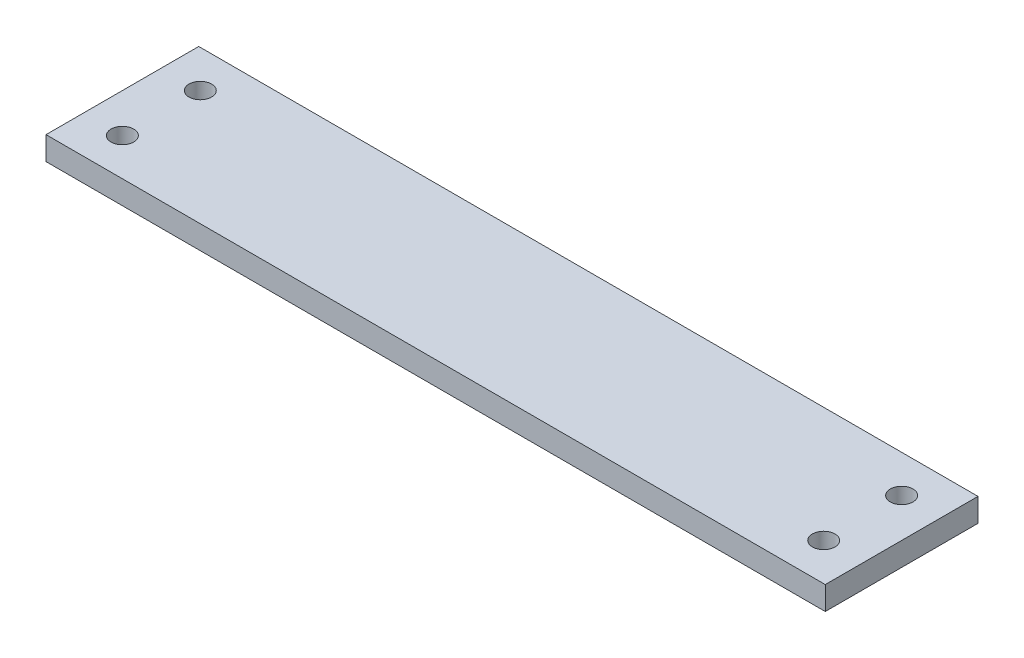
ISO-10303-21;
HEADER;
FILE_DESCRIPTION(('STEP AP214'),'2;1');
FILE_NAME('part.step','',(''),(''),'','','');
FILE_SCHEMA(('AUTOMOTIVE_DESIGN { 1 0 10303 214 1 1 1 1 }'));
ENDSEC;
DATA;
#1=APPLICATION_CONTEXT('core data for automotive mechanical design processes');
#2=APPLICATION_PROTOCOL_DEFINITION('international standard','automotive_design',2000,#1);
#3=PRODUCT_CONTEXT('',#1,'mechanical');
#4=PRODUCT('Part','Part','',(#3));
#5=PRODUCT_RELATED_PRODUCT_CATEGORY('part','',(#4));
#6=PRODUCT_DEFINITION_FORMATION('','',#4);
#7=PRODUCT_DEFINITION_CONTEXT('part definition',#1,'design');
#8=PRODUCT_DEFINITION('design','',#6,#7);
#9=PRODUCT_DEFINITION_SHAPE('','',#8);
#10=(LENGTH_UNIT() NAMED_UNIT(*) SI_UNIT(.MILLI.,.METRE.));
#11=(NAMED_UNIT(*) PLANE_ANGLE_UNIT() SI_UNIT($,.RADIAN.));
#12=(NAMED_UNIT(*) SI_UNIT($,.STERADIAN.) SOLID_ANGLE_UNIT());
#13=UNCERTAINTY_MEASURE_WITH_UNIT(LENGTH_MEASURE(1.E-05),#10,'distance_accuracy_value','');
#14=(GEOMETRIC_REPRESENTATION_CONTEXT(3) GLOBAL_UNCERTAINTY_ASSIGNED_CONTEXT((#13)) GLOBAL_UNIT_ASSIGNED_CONTEXT((#10,
#11,#12)) REPRESENTATION_CONTEXT('',''));
#15=CARTESIAN_POINT('',(0.,0.,0.));
#16=DIRECTION('',(0.,0.,1.));
#17=DIRECTION('',(1.,0.,0.));
#18=AXIS2_PLACEMENT_3D('',#15,#16,#17);
#19=CARTESIAN_POINT('',(0.,3.,0.));
#20=DIRECTION('',(-1.,0.,0.));
#21=DIRECTION('',(0.,0.,1.));
#22=AXIS2_PLACEMENT_3D('',#19,#20,#21);
#23=PLANE('',#22);
#24=DIRECTION('',(0.,-1.,0.));
#25=VECTOR('',#24,1.);
#26=CARTESIAN_POINT('',(0.,3.,-19.8));
#27=LINE('',#26,#25);
#28=CARTESIAN_POINT('',(0.,3.,-19.8));
#29=VERTEX_POINT('',#28);
#30=CARTESIAN_POINT('',(0.,0.,-19.8));
#31=VERTEX_POINT('',#30);
#32=EDGE_CURVE('E52',#29,#31,#27,.T.);
#33=ORIENTED_EDGE('',*,*,#32,.F.);
#34=DIRECTION('',(0.,0.,-1.));
#35=VECTOR('',#34,1.);
#36=CARTESIAN_POINT('',(0.,3.,0.));
#37=LINE('',#36,#35);
#38=CARTESIAN_POINT('',(0.,3.,-0.2));
#39=VERTEX_POINT('',#38);
#40=EDGE_CURVE('E44',#39,#29,#37,.T.);
#41=ORIENTED_EDGE('',*,*,#40,.F.);
#42=DIRECTION('',(0.,1.,0.));
#43=VECTOR('',#42,1.);
#44=CARTESIAN_POINT('',(0.,0.,-0.2));
#45=LINE('',#44,#43);
#46=CARTESIAN_POINT('',(0.,0.,-0.2));
#47=VERTEX_POINT('',#46);
#48=EDGE_CURVE('E144',#47,#39,#45,.T.);
#49=ORIENTED_EDGE('',*,*,#48,.F.);
#50=DIRECTION('',(0.,0.,-1.));
#51=VECTOR('',#50,1.);
#52=CARTESIAN_POINT('',(0.,0.,0.));
#53=LINE('',#52,#51);
#54=EDGE_CURVE('E91',#47,#31,#53,.T.);
#55=ORIENTED_EDGE('',*,*,#54,.T.);
#56=EDGE_LOOP('',(#33,#41,#49,#55));
#57=FACE_BOUND('',#56,.T.);
#58=ADVANCED_FACE('F36',(#57),#23,.F.);
#59=CARTESIAN_POINT('',(-100.,3.,0.));
#60=DIRECTION('',(1.,0.,0.));
#61=DIRECTION('',(0.,0.,-1.));
#62=AXIS2_PLACEMENT_3D('',#59,#60,#61);
#63=PLANE('',#62);
#64=DIRECTION('',(0.,1.,0.));
#65=VECTOR('',#64,1.);
#66=CARTESIAN_POINT('',(-100.,0.,-19.8));
#67=LINE('',#66,#65);
#68=CARTESIAN_POINT('',(-100.,0.,-19.8));
#69=VERTEX_POINT('',#68);
#70=CARTESIAN_POINT('',(-100.,3.,-19.8));
#71=VERTEX_POINT('',#70);
#72=EDGE_CURVE('E78',#69,#71,#67,.T.);
#73=ORIENTED_EDGE('',*,*,#72,.F.);
#74=DIRECTION('',(0.,0.,1.));
#75=VECTOR('',#74,1.);
#76=CARTESIAN_POINT('',(-100.,0.,0.));
#77=LINE('',#76,#75);
#78=CARTESIAN_POINT('',(-100.,0.,-0.2));
#79=VERTEX_POINT('',#78);
#80=EDGE_CURVE('E60',#69,#79,#77,.T.);
#81=ORIENTED_EDGE('',*,*,#80,.T.);
#82=DIRECTION('',(0.,-1.,0.));
#83=VECTOR('',#82,1.);
#84=CARTESIAN_POINT('',(-100.,3.,-0.2));
#85=LINE('',#84,#83);
#86=CARTESIAN_POINT('',(-100.,3.,-0.2));
#87=VERTEX_POINT('',#86);
#88=EDGE_CURVE('E239',#87,#79,#85,.T.);
#89=ORIENTED_EDGE('',*,*,#88,.F.);
#90=DIRECTION('',(0.,0.,1.));
#91=VECTOR('',#90,1.);
#92=CARTESIAN_POINT('',(-100.,3.,0.));
#93=LINE('',#92,#91);
#94=EDGE_CURVE('E11',#71,#87,#93,.T.);
#95=ORIENTED_EDGE('',*,*,#94,.F.);
#96=EDGE_LOOP('',(#73,#81,#89,#95));
#97=FACE_BOUND('',#96,.T.);
#98=ADVANCED_FACE('F85',(#97),#63,.F.);
#99=CARTESIAN_POINT('',(0.,3.,0.));
#100=DIRECTION('',(0.,1.,0.));
#101=DIRECTION('',(0.,0.,1.));
#102=AXIS2_PLACEMENT_3D('',#99,#100,#101);
#103=PLANE('',#102);
#104=CARTESIAN_POINT('',(-5.,3.,-15.));
#105=DIRECTION('',(0.,1.,0.));
#106=DIRECTION('',(0.,0.,-1.));
#107=AXIS2_PLACEMENT_3D('',#104,#105,#106);
#108=CIRCLE('',#107,1.45);
#109=CARTESIAN_POINT('',(-5.,3.,-16.45));
#110=VERTEX_POINT('',#109);
#111=EDGE_CURVE('E143',#110,#110,#108,.T.);
#112=ORIENTED_EDGE('',*,*,#111,.F.);
#113=EDGE_LOOP('',(#112));
#114=FACE_BOUND('',#113,.T.);
#115=CARTESIAN_POINT('',(-5.,3.,-4.99999999999999));
#116=DIRECTION('',(0.,1.,0.));
#117=DIRECTION('',(0.,0.,1.));
#118=AXIS2_PLACEMENT_3D('',#115,#116,#117);
#119=CIRCLE('',#118,1.45);
#120=CARTESIAN_POINT('',(-5.,3.,-3.54999999999999));
#121=VERTEX_POINT('',#120);
#122=EDGE_CURVE('E146',#121,#121,#119,.T.);
#123=ORIENTED_EDGE('',*,*,#122,.F.);
#124=EDGE_LOOP('',(#123));
#125=FACE_BOUND('',#124,.T.);
#126=CARTESIAN_POINT('',(-95.,3.,-4.99999999999999));
#127=DIRECTION('',(0.,1.,0.));
#128=DIRECTION('',(0.,0.,-1.));
#129=AXIS2_PLACEMENT_3D('',#126,#127,#128);
#130=CIRCLE('',#129,1.45);
#131=CARTESIAN_POINT('',(-95.,3.,-6.44999999999999));
#132=VERTEX_POINT('',#131);
#133=EDGE_CURVE('E151',#132,#132,#130,.T.);
#134=ORIENTED_EDGE('',*,*,#133,.F.);
#135=EDGE_LOOP('',(#134));
#136=FACE_BOUND('',#135,.T.);
#137=CARTESIAN_POINT('',(-95.,3.,-15.));
#138=DIRECTION('',(0.,1.,0.));
#139=DIRECTION('',(0.,0.,1.));
#140=AXIS2_PLACEMENT_3D('',#137,#138,#139);
#141=CIRCLE('',#140,1.45);
#142=CARTESIAN_POINT('',(-95.,3.,-13.55));
#143=VERTEX_POINT('',#142);
#144=EDGE_CURVE('E101',#143,#143,#141,.T.);
#145=ORIENTED_EDGE('',*,*,#144,.F.);
#146=EDGE_LOOP('',(#145));
#147=FACE_BOUND('',#146,.T.);
#148=ORIENTED_EDGE('',*,*,#40,.T.);
#149=DIRECTION('',(1.,0.,0.));
#150=VECTOR('',#149,1.);
#151=CARTESIAN_POINT('',(-100.,3.,-19.8));
#152=LINE('',#151,#150);
#153=EDGE_CURVE('E86',#71,#29,#152,.T.);
#154=ORIENTED_EDGE('',*,*,#153,.F.);
#155=ORIENTED_EDGE('',*,*,#94,.T.);
#156=DIRECTION('',(-1.,0.,0.));
#157=VECTOR('',#156,1.);
#158=CARTESIAN_POINT('',(0.,3.,-0.2));
#159=LINE('',#158,#157);
#160=EDGE_CURVE('E142',#39,#87,#159,.T.);
#161=ORIENTED_EDGE('',*,*,#160,.F.);
#162=EDGE_LOOP('',(#148,#154,#155,#161));
#163=FACE_BOUND('',#162,.T.);
#164=ADVANCED_FACE('F135',(#114,#125,#136,#147,#163),#103,.T.);
#165=CARTESIAN_POINT('',(0.,0.,0.));
#166=DIRECTION('',(0.,1.,0.));
#167=DIRECTION('',(0.,0.,1.));
#168=AXIS2_PLACEMENT_3D('',#165,#166,#167);
#169=PLANE('',#168);
#170=CARTESIAN_POINT('',(-5.,0.,-15.));
#171=DIRECTION('',(0.,1.,0.));
#172=DIRECTION('',(0.,0.,1.));
#173=AXIS2_PLACEMENT_3D('',#170,#171,#172);
#174=CIRCLE('',#173,1.45);
#175=CARTESIAN_POINT('',(-5.,0.,-13.55));
#176=VERTEX_POINT('',#175);
#177=EDGE_CURVE('E39',#176,#176,#174,.T.);
#178=ORIENTED_EDGE('',*,*,#177,.T.);
#179=EDGE_LOOP('',(#178));
#180=FACE_BOUND('',#179,.T.);
#181=CARTESIAN_POINT('',(-5.,0.,-4.99999999999999));
#182=DIRECTION('',(0.,1.,0.));
#183=DIRECTION('',(0.,0.,1.));
#184=AXIS2_PLACEMENT_3D('',#181,#182,#183);
#185=CIRCLE('',#184,1.45);
#186=CARTESIAN_POINT('',(-5.,0.,-3.54999999999999));
#187=VERTEX_POINT('',#186);
#188=EDGE_CURVE('E103',#187,#187,#185,.T.);
#189=ORIENTED_EDGE('',*,*,#188,.T.);
#190=EDGE_LOOP('',(#189));
#191=FACE_BOUND('',#190,.T.);
#192=CARTESIAN_POINT('',(-95.,0.,-4.99999999999999));
#193=DIRECTION('',(0.,1.,0.));
#194=DIRECTION('',(0.,0.,1.));
#195=AXIS2_PLACEMENT_3D('',#192,#193,#194);
#196=CIRCLE('',#195,1.45);
#197=CARTESIAN_POINT('',(-95.,0.,-3.54999999999999));
#198=VERTEX_POINT('',#197);
#199=EDGE_CURVE('E100',#198,#198,#196,.T.);
#200=ORIENTED_EDGE('',*,*,#199,.T.);
#201=EDGE_LOOP('',(#200));
#202=FACE_BOUND('',#201,.T.);
#203=CARTESIAN_POINT('',(-95.,0.,-15.));
#204=DIRECTION('',(0.,1.,0.));
#205=DIRECTION('',(0.,0.,1.));
#206=AXIS2_PLACEMENT_3D('',#203,#204,#205);
#207=CIRCLE('',#206,1.45);
#208=CARTESIAN_POINT('',(-95.,0.,-13.55));
#209=VERTEX_POINT('',#208);
#210=EDGE_CURVE('E97',#209,#209,#207,.T.);
#211=ORIENTED_EDGE('',*,*,#210,.T.);
#212=EDGE_LOOP('',(#211));
#213=FACE_BOUND('',#212,.T.);
#214=DIRECTION('',(-1.,0.,0.));
#215=VECTOR('',#214,1.);
#216=CARTESIAN_POINT('',(0.,0.,-19.8));
#217=LINE('',#216,#215);
#218=EDGE_CURVE('E76',#31,#69,#217,.T.);
#219=ORIENTED_EDGE('',*,*,#218,.F.);
#220=ORIENTED_EDGE('',*,*,#54,.F.);
#221=DIRECTION('',(1.,0.,0.));
#222=VECTOR('',#221,1.);
#223=CARTESIAN_POINT('',(-100.,0.,-0.2));
#224=LINE('',#223,#222);
#225=EDGE_CURVE('E90',#79,#47,#224,.T.);
#226=ORIENTED_EDGE('',*,*,#225,.F.);
#227=ORIENTED_EDGE('',*,*,#80,.F.);
#228=EDGE_LOOP('',(#219,#220,#226,#227));
#229=FACE_BOUND('',#228,.T.);
#230=ADVANCED_FACE('F89',(#180,#191,#202,#213,#229),#169,.F.);
#231=CARTESIAN_POINT('',(-95.,-3.,-15.));
#232=DIRECTION('',(0.,1.,0.));
#233=DIRECTION('',(0.,0.,1.));
#234=AXIS2_PLACEMENT_3D('',#231,#232,#233);
#235=CYLINDRICAL_SURFACE('',#234,1.45);
#236=ORIENTED_EDGE('',*,*,#144,.T.);
#237=EDGE_LOOP('',(#236));
#238=FACE_BOUND('',#237,.T.);
#239=ORIENTED_EDGE('',*,*,#210,.F.);
#240=EDGE_LOOP('',(#239));
#241=FACE_BOUND('',#240,.T.);
#242=ADVANCED_FACE('F159',(#238,#241),#235,.F.);
#243=CARTESIAN_POINT('',(-95.,-3.,-4.99999999999999));
#244=DIRECTION('',(0.,1.,0.));
#245=DIRECTION('',(0.,0.,1.));
#246=AXIS2_PLACEMENT_3D('',#243,#244,#245);
#247=CYLINDRICAL_SURFACE('',#246,1.45);
#248=ORIENTED_EDGE('',*,*,#133,.T.);
#249=EDGE_LOOP('',(#248));
#250=FACE_BOUND('',#249,.T.);
#251=ORIENTED_EDGE('',*,*,#199,.F.);
#252=EDGE_LOOP('',(#251));
#253=FACE_BOUND('',#252,.T.);
#254=ADVANCED_FACE('F124',(#250,#253),#247,.F.);
#255=CARTESIAN_POINT('',(-5.,-3.,-4.99999999999999));
#256=DIRECTION('',(0.,1.,0.));
#257=DIRECTION('',(0.,0.,1.));
#258=AXIS2_PLACEMENT_3D('',#255,#256,#257);
#259=CYLINDRICAL_SURFACE('',#258,1.45);
#260=ORIENTED_EDGE('',*,*,#122,.T.);
#261=EDGE_LOOP('',(#260));
#262=FACE_BOUND('',#261,.T.);
#263=ORIENTED_EDGE('',*,*,#188,.F.);
#264=EDGE_LOOP('',(#263));
#265=FACE_BOUND('',#264,.T.);
#266=ADVANCED_FACE('F114',(#262,#265),#259,.F.);
#267=CARTESIAN_POINT('',(-5.,-3.,-15.));
#268=DIRECTION('',(0.,1.,0.));
#269=DIRECTION('',(0.,0.,1.));
#270=AXIS2_PLACEMENT_3D('',#267,#268,#269);
#271=CYLINDRICAL_SURFACE('',#270,1.45);
#272=ORIENTED_EDGE('',*,*,#111,.T.);
#273=EDGE_LOOP('',(#272));
#274=FACE_BOUND('',#273,.T.);
#275=ORIENTED_EDGE('',*,*,#177,.F.);
#276=EDGE_LOOP('',(#275));
#277=FACE_BOUND('',#276,.T.);
#278=ADVANCED_FACE('F111',(#274,#277),#271,.F.);
#279=CARTESIAN_POINT('',(0.,0.,-0.2));
#280=DIRECTION('',(0.,0.,1.));
#281=DIRECTION('',(1.,0.,0.));
#282=AXIS2_PLACEMENT_3D('',#279,#280,#281);
#283=PLANE('',#282);
#284=ORIENTED_EDGE('',*,*,#88,.T.);
#285=ORIENTED_EDGE('',*,*,#225,.T.);
#286=ORIENTED_EDGE('',*,*,#48,.T.);
#287=ORIENTED_EDGE('',*,*,#160,.T.);
#288=EDGE_LOOP('',(#284,#285,#286,#287));
#289=FACE_BOUND('',#288,.T.);
#290=ADVANCED_FACE('F113',(#289),#283,.T.);
#291=CARTESIAN_POINT('',(0.,0.,-19.8));
#292=DIRECTION('',(0.,0.,-1.));
#293=DIRECTION('',(-1.,0.,0.));
#294=AXIS2_PLACEMENT_3D('',#291,#292,#293);
#295=PLANE('',#294);
#296=ORIENTED_EDGE('',*,*,#32,.T.);
#297=ORIENTED_EDGE('',*,*,#218,.T.);
#298=ORIENTED_EDGE('',*,*,#72,.T.);
#299=ORIENTED_EDGE('',*,*,#153,.T.);
#300=EDGE_LOOP('',(#296,#297,#298,#299));
#301=FACE_BOUND('',#300,.T.);
#302=ADVANCED_FACE('F77',(#301),#295,.T.);
#303=CLOSED_SHELL('',(#58,#98,#164,#230,#242,#254,#266,#278,#290,#302));
#304=MANIFOLD_SOLID_BREP('B2',#303);
#305=ADVANCED_BREP_SHAPE_REPRESENTATION('',(#18,#304),#14);
#306=SHAPE_DEFINITION_REPRESENTATION(#9,#305);
ENDSEC;
END-ISO-10303-21;
